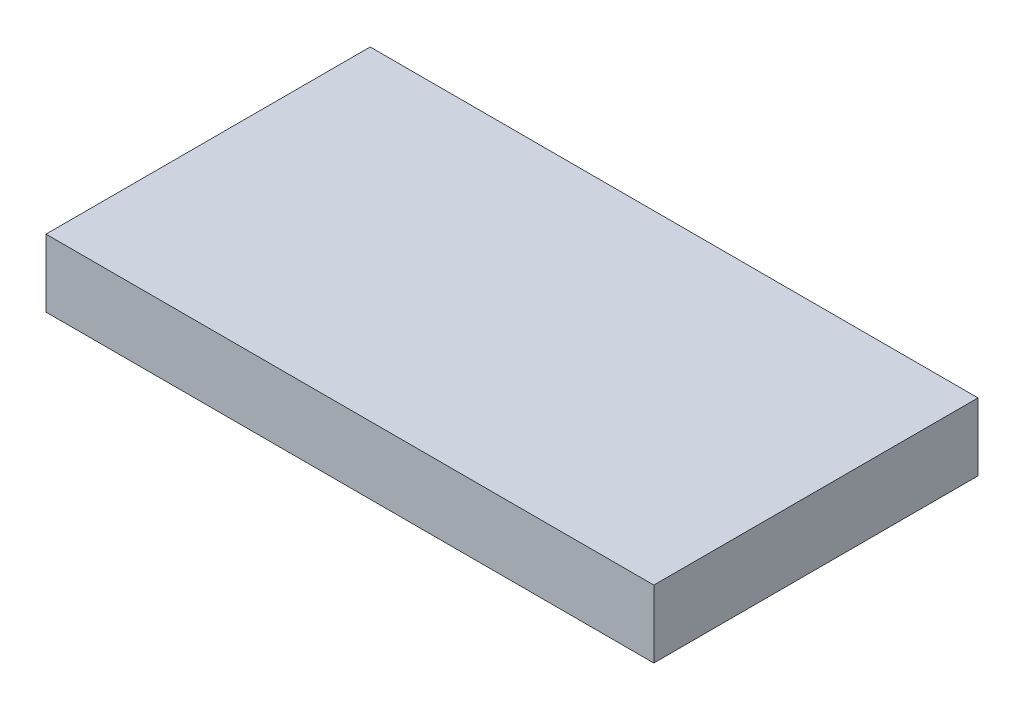
ISO-10303-21;
HEADER;
FILE_DESCRIPTION(('STEP AP214'),'2;1');
FILE_NAME('part.step','',(''),(''),'','','');
FILE_SCHEMA(('AUTOMOTIVE_DESIGN { 1 0 10303 214 1 1 1 1 }'));
ENDSEC;
DATA;
#1=APPLICATION_CONTEXT('core data for automotive mechanical design processes');
#2=APPLICATION_PROTOCOL_DEFINITION('international standard','automotive_design',2000,#1);
#3=PRODUCT_CONTEXT('',#1,'mechanical');
#4=PRODUCT('Part','Part','',(#3));
#5=PRODUCT_RELATED_PRODUCT_CATEGORY('part','',(#4));
#6=PRODUCT_DEFINITION_FORMATION('','',#4);
#7=PRODUCT_DEFINITION_CONTEXT('part definition',#1,'design');
#8=PRODUCT_DEFINITION('design','',#6,#7);
#9=PRODUCT_DEFINITION_SHAPE('','',#8);
#10=(LENGTH_UNIT() NAMED_UNIT(*) SI_UNIT(.MILLI.,.METRE.));
#11=(NAMED_UNIT(*) PLANE_ANGLE_UNIT() SI_UNIT($,.RADIAN.));
#12=(NAMED_UNIT(*) SI_UNIT($,.STERADIAN.) SOLID_ANGLE_UNIT());
#13=UNCERTAINTY_MEASURE_WITH_UNIT(LENGTH_MEASURE(1.E-05),#10,'distance_accuracy_value','');
#14=(GEOMETRIC_REPRESENTATION_CONTEXT(3) GLOBAL_UNCERTAINTY_ASSIGNED_CONTEXT((#13)) GLOBAL_UNIT_ASSIGNED_CONTEXT((#10,
#11,#12)) REPRESENTATION_CONTEXT('',''));
#15=CARTESIAN_POINT('',(0.,0.,0.));
#16=DIRECTION('',(0.,0.,1.));
#17=DIRECTION('',(1.,0.,0.));
#18=AXIS2_PLACEMENT_3D('',#15,#16,#17);
#19=CARTESIAN_POINT('',(225.,50.,120.));
#20=DIRECTION('',(-1.,0.,0.));
#21=DIRECTION('',(0.,0.,1.));
#22=AXIS2_PLACEMENT_3D('',#19,#20,#21);
#23=PLANE('',#22);
#24=DIRECTION('',(0.,0.,-1.));
#25=VECTOR('',#24,1.);
#26=CARTESIAN_POINT('',(225.,0.,120.));
#27=LINE('',#26,#25);
#28=CARTESIAN_POINT('',(225.,0.,120.));
#29=VERTEX_POINT('',#28);
#30=CARTESIAN_POINT('',(225.,0.,-120.));
#31=VERTEX_POINT('',#30);
#32=EDGE_CURVE('E80',#29,#31,#27,.T.);
#33=ORIENTED_EDGE('',*,*,#32,.T.);
#34=DIRECTION('',(0.,-1.,0.));
#35=VECTOR('',#34,1.);
#36=CARTESIAN_POINT('',(225.,50.,-120.));
#37=LINE('',#36,#35);
#38=CARTESIAN_POINT('',(225.,50.,-120.));
#39=VERTEX_POINT('',#38);
#40=EDGE_CURVE('E11',#39,#31,#37,.T.);
#41=ORIENTED_EDGE('',*,*,#40,.F.);
#42=DIRECTION('',(0.,0.,-1.));
#43=VECTOR('',#42,1.);
#44=CARTESIAN_POINT('',(225.,50.,120.));
#45=LINE('',#44,#43);
#46=CARTESIAN_POINT('',(225.,50.,120.));
#47=VERTEX_POINT('',#46);
#48=EDGE_CURVE('E68',#47,#39,#45,.T.);
#49=ORIENTED_EDGE('',*,*,#48,.F.);
#50=DIRECTION('',(0.,-1.,0.));
#51=VECTOR('',#50,1.);
#52=CARTESIAN_POINT('',(225.,50.,120.));
#53=LINE('',#52,#51);
#54=EDGE_CURVE('E76',#47,#29,#53,.T.);
#55=ORIENTED_EDGE('',*,*,#54,.T.);
#56=EDGE_LOOP('',(#33,#41,#49,#55));
#57=FACE_BOUND('',#56,.T.);
#58=ADVANCED_FACE('F17',(#57),#23,.F.);
#59=CARTESIAN_POINT('',(-225.,50.,-120.));
#60=DIRECTION('',(0.,0.,1.));
#61=DIRECTION('',(1.,0.,0.));
#62=AXIS2_PLACEMENT_3D('',#59,#60,#61);
#63=PLANE('',#62);
#64=DIRECTION('',(-1.,0.,0.));
#65=VECTOR('',#64,1.);
#66=CARTESIAN_POINT('',(-225.,0.,-120.));
#67=LINE('',#66,#65);
#68=CARTESIAN_POINT('',(-225.,0.,-120.));
#69=VERTEX_POINT('',#68);
#70=EDGE_CURVE('E72',#31,#69,#67,.T.);
#71=ORIENTED_EDGE('',*,*,#70,.T.);
#72=DIRECTION('',(0.,-1.,0.));
#73=VECTOR('',#72,1.);
#74=CARTESIAN_POINT('',(-225.,50.,-120.));
#75=LINE('',#74,#73);
#76=CARTESIAN_POINT('',(-225.,50.,-120.));
#77=VERTEX_POINT('',#76);
#78=EDGE_CURVE('E25',#77,#69,#75,.T.);
#79=ORIENTED_EDGE('',*,*,#78,.F.);
#80=DIRECTION('',(-1.,0.,0.));
#81=VECTOR('',#80,1.);
#82=CARTESIAN_POINT('',(-225.,50.,-120.));
#83=LINE('',#82,#81);
#84=EDGE_CURVE('E63',#39,#77,#83,.T.);
#85=ORIENTED_EDGE('',*,*,#84,.F.);
#86=ORIENTED_EDGE('',*,*,#40,.T.);
#87=EDGE_LOOP('',(#71,#79,#85,#86));
#88=FACE_BOUND('',#87,.T.);
#89=ADVANCED_FACE('F71',(#88),#63,.F.);
#90=CARTESIAN_POINT('',(-225.,50.,120.));
#91=DIRECTION('',(1.,0.,0.));
#92=DIRECTION('',(0.,0.,-1.));
#93=AXIS2_PLACEMENT_3D('',#90,#91,#92);
#94=PLANE('',#93);
#95=DIRECTION('',(0.,0.,1.));
#96=VECTOR('',#95,1.);
#97=CARTESIAN_POINT('',(-225.,0.,120.));
#98=LINE('',#97,#96);
#99=CARTESIAN_POINT('',(-225.,0.,120.));
#100=VERTEX_POINT('',#99);
#101=EDGE_CURVE('E50',#69,#100,#98,.T.);
#102=ORIENTED_EDGE('',*,*,#101,.T.);
#103=DIRECTION('',(0.,-1.,0.));
#104=VECTOR('',#103,1.);
#105=CARTESIAN_POINT('',(-225.,50.,120.));
#106=LINE('',#105,#104);
#107=CARTESIAN_POINT('',(-225.,50.,120.));
#108=VERTEX_POINT('',#107);
#109=EDGE_CURVE('E73',#108,#100,#106,.T.);
#110=ORIENTED_EDGE('',*,*,#109,.F.);
#111=DIRECTION('',(0.,0.,1.));
#112=VECTOR('',#111,1.);
#113=CARTESIAN_POINT('',(-225.,50.,120.));
#114=LINE('',#113,#112);
#115=EDGE_CURVE('E66',#77,#108,#114,.T.);
#116=ORIENTED_EDGE('',*,*,#115,.F.);
#117=ORIENTED_EDGE('',*,*,#78,.T.);
#118=EDGE_LOOP('',(#102,#110,#116,#117));
#119=FACE_BOUND('',#118,.T.);
#120=ADVANCED_FACE('F74',(#119),#94,.F.);
#121=CARTESIAN_POINT('',(-225.,50.,120.));
#122=DIRECTION('',(0.,0.,-1.));
#123=DIRECTION('',(-1.,0.,0.));
#124=AXIS2_PLACEMENT_3D('',#121,#122,#123);
#125=PLANE('',#124);
#126=DIRECTION('',(1.,0.,0.));
#127=VECTOR('',#126,1.);
#128=CARTESIAN_POINT('',(-225.,0.,120.));
#129=LINE('',#128,#127);
#130=EDGE_CURVE('E56',#100,#29,#129,.T.);
#131=ORIENTED_EDGE('',*,*,#130,.T.);
#132=ORIENTED_EDGE('',*,*,#54,.F.);
#133=DIRECTION('',(1.,0.,0.));
#134=VECTOR('',#133,1.);
#135=CARTESIAN_POINT('',(-225.,50.,120.));
#136=LINE('',#135,#134);
#137=EDGE_CURVE('E33',#108,#47,#136,.T.);
#138=ORIENTED_EDGE('',*,*,#137,.F.);
#139=ORIENTED_EDGE('',*,*,#109,.T.);
#140=EDGE_LOOP('',(#131,#132,#138,#139));
#141=FACE_BOUND('',#140,.T.);
#142=ADVANCED_FACE('F87',(#141),#125,.F.);
#143=CARTESIAN_POINT('',(0.,50.,0.));
#144=DIRECTION('',(0.,-1.,0.));
#145=DIRECTION('',(0.,0.,-1.));
#146=AXIS2_PLACEMENT_3D('',#143,#144,#145);
#147=PLANE('',#146);
#148=ORIENTED_EDGE('',*,*,#48,.T.);
#149=ORIENTED_EDGE('',*,*,#84,.T.);
#150=ORIENTED_EDGE('',*,*,#115,.T.);
#151=ORIENTED_EDGE('',*,*,#137,.T.);
#152=EDGE_LOOP('',(#148,#149,#150,#151));
#153=FACE_BOUND('',#152,.T.);
#154=ADVANCED_FACE('F64',(#153),#147,.F.);
#155=CARTESIAN_POINT('',(0.,0.,0.));
#156=DIRECTION('',(0.,-1.,0.));
#157=DIRECTION('',(0.,0.,-1.));
#158=AXIS2_PLACEMENT_3D('',#155,#156,#157);
#159=PLANE('',#158);
#160=ORIENTED_EDGE('',*,*,#32,.F.);
#161=ORIENTED_EDGE('',*,*,#130,.F.);
#162=ORIENTED_EDGE('',*,*,#101,.F.);
#163=ORIENTED_EDGE('',*,*,#70,.F.);
#164=EDGE_LOOP('',(#160,#161,#162,#163));
#165=FACE_BOUND('',#164,.T.);
#166=ADVANCED_FACE('F90',(#165),#159,.T.);
#167=CLOSED_SHELL('',(#58,#89,#120,#142,#154,#166));
#168=MANIFOLD_SOLID_BREP('B1',#167);
#169=ADVANCED_BREP_SHAPE_REPRESENTATION('',(#18,#168),#14);
#170=SHAPE_DEFINITION_REPRESENTATION(#9,#169);
ENDSEC;
END-ISO-10303-21;
